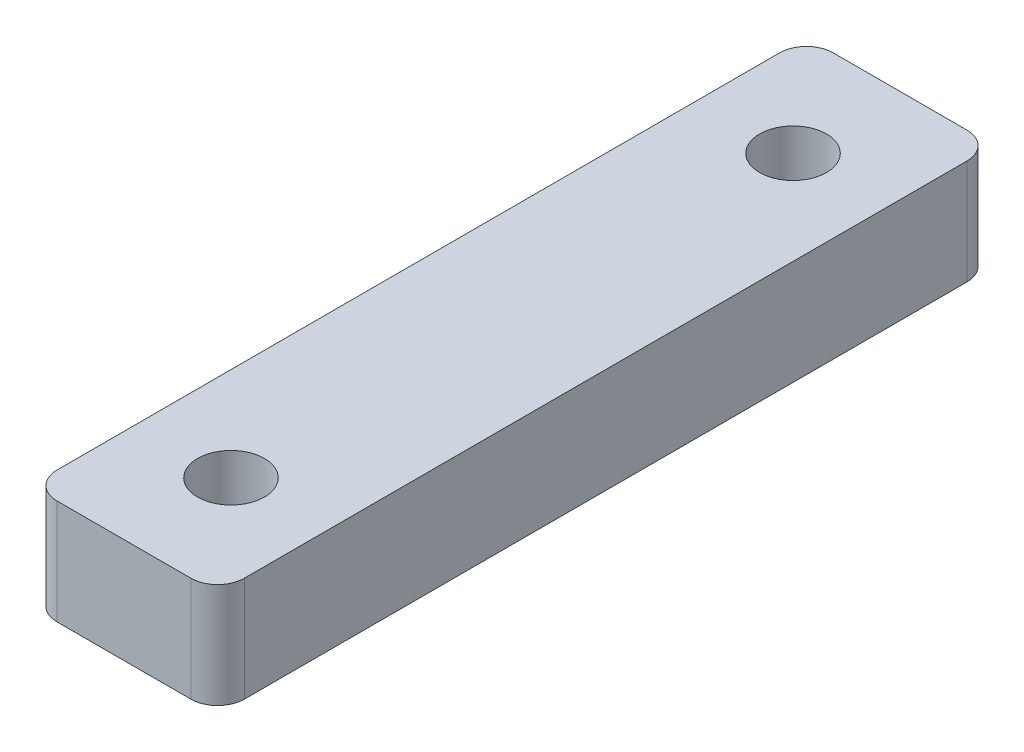
ISO-10303-21;
HEADER;
FILE_DESCRIPTION(('STEP AP214'),'2;1');
FILE_NAME('part.step','',(''),(''),'','','');
FILE_SCHEMA(('AUTOMOTIVE_DESIGN { 1 0 10303 214 1 1 1 1 }'));
ENDSEC;
DATA;
#1=APPLICATION_CONTEXT('core data for automotive mechanical design processes');
#2=APPLICATION_PROTOCOL_DEFINITION('international standard','automotive_design',2000,#1);
#3=PRODUCT_CONTEXT('',#1,'mechanical');
#4=PRODUCT('Part','Part','',(#3));
#5=PRODUCT_RELATED_PRODUCT_CATEGORY('part','',(#4));
#6=PRODUCT_DEFINITION_FORMATION('','',#4);
#7=PRODUCT_DEFINITION_CONTEXT('part definition',#1,'design');
#8=PRODUCT_DEFINITION('design','',#6,#7);
#9=PRODUCT_DEFINITION_SHAPE('','',#8);
#10=(LENGTH_UNIT() NAMED_UNIT(*) SI_UNIT(.MILLI.,.METRE.));
#11=(NAMED_UNIT(*) PLANE_ANGLE_UNIT() SI_UNIT($,.RADIAN.));
#12=(NAMED_UNIT(*) SI_UNIT($,.STERADIAN.) SOLID_ANGLE_UNIT());
#13=UNCERTAINTY_MEASURE_WITH_UNIT(LENGTH_MEASURE(1.E-05),#10,'distance_accuracy_value','');
#14=(GEOMETRIC_REPRESENTATION_CONTEXT(3) GLOBAL_UNCERTAINTY_ASSIGNED_CONTEXT((#13)) GLOBAL_UNIT_ASSIGNED_CONTEXT((#10,
#11,#12)) REPRESENTATION_CONTEXT('',''));
#15=CARTESIAN_POINT('',(0.,0.,0.));
#16=DIRECTION('',(0.,0.,1.));
#17=DIRECTION('',(1.,0.,0.));
#18=AXIS2_PLACEMENT_3D('',#15,#16,#17);
#19=CARTESIAN_POINT('',(0.,7.83,0.));
#20=DIRECTION('',(0.,0.,-1.));
#21=DIRECTION('',(-1.,0.,0.));
#22=AXIS2_PLACEMENT_3D('',#19,#20,#21);
#23=PLANE('',#22);
#24=DIRECTION('',(1.,0.,0.));
#25=VECTOR('',#24,1.);
#26=CARTESIAN_POINT('',(0.,0.,0.));
#27=LINE('',#26,#25);
#28=CARTESIAN_POINT('',(2.,0.,0.));
#29=VERTEX_POINT('',#28);
#30=CARTESIAN_POINT('',(12.,0.,0.));
#31=VERTEX_POINT('',#30);
#32=EDGE_CURVE('E137',#29,#31,#27,.T.);
#33=ORIENTED_EDGE('',*,*,#32,.T.);
#34=DIRECTION('',(0.,-1.,0.));
#35=VECTOR('',#34,1.);
#36=CARTESIAN_POINT('',(12.,7.83,0.));
#37=LINE('',#36,#35);
#38=CARTESIAN_POINT('',(12.,7.83,0.));
#39=VERTEX_POINT('',#38);
#40=EDGE_CURVE('E113',#31,#39,#37,.F.);
#41=ORIENTED_EDGE('',*,*,#40,.T.);
#42=DIRECTION('',(1.,0.,0.));
#43=VECTOR('',#42,1.);
#44=CARTESIAN_POINT('',(0.,7.83,0.));
#45=LINE('',#44,#43);
#46=CARTESIAN_POINT('',(2.,7.83,0.));
#47=VERTEX_POINT('',#46);
#48=EDGE_CURVE('E152',#47,#39,#45,.T.);
#49=ORIENTED_EDGE('',*,*,#48,.F.);
#50=DIRECTION('',(0.,-1.,0.));
#51=VECTOR('',#50,1.);
#52=CARTESIAN_POINT('',(2.,0.,0.));
#53=LINE('',#52,#51);
#54=EDGE_CURVE('E118',#47,#29,#53,.T.);
#55=ORIENTED_EDGE('',*,*,#54,.T.);
#56=EDGE_LOOP('',(#33,#41,#49,#55));
#57=FACE_BOUND('',#56,.T.);
#58=ADVANCED_FACE('F41',(#57),#23,.F.);
#59=CARTESIAN_POINT('',(14.,7.83,0.));
#60=DIRECTION('',(-1.,0.,0.));
#61=DIRECTION('',(0.,0.,1.));
#62=AXIS2_PLACEMENT_3D('',#59,#60,#61);
#63=PLANE('',#62);
#64=DIRECTION('',(0.,0.,-1.));
#65=VECTOR('',#64,1.);
#66=CARTESIAN_POINT('',(14.,7.83,0.));
#67=LINE('',#66,#65);
#68=CARTESIAN_POINT('',(14.,7.83,-2.));
#69=VERTEX_POINT('',#68);
#70=CARTESIAN_POINT('',(14.,7.83,-56.));
#71=VERTEX_POINT('',#70);
#72=EDGE_CURVE('E128',#69,#71,#67,.T.);
#73=ORIENTED_EDGE('',*,*,#72,.F.);
#74=DIRECTION('',(0.,-1.,0.));
#75=VECTOR('',#74,1.);
#76=CARTESIAN_POINT('',(14.,7.83,-2.));
#77=LINE('',#76,#75);
#78=CARTESIAN_POINT('',(14.,0.,-2.));
#79=VERTEX_POINT('',#78);
#80=EDGE_CURVE('E112',#69,#79,#77,.T.);
#81=ORIENTED_EDGE('',*,*,#80,.T.);
#82=DIRECTION('',(0.,0.,-1.));
#83=VECTOR('',#82,1.);
#84=CARTESIAN_POINT('',(14.,0.,0.));
#85=LINE('',#84,#83);
#86=CARTESIAN_POINT('',(14.,0.,-56.));
#87=VERTEX_POINT('',#86);
#88=EDGE_CURVE('E125',#79,#87,#85,.T.);
#89=ORIENTED_EDGE('',*,*,#88,.T.);
#90=DIRECTION('',(0.,-1.,0.));
#91=VECTOR('',#90,1.);
#92=CARTESIAN_POINT('',(14.,7.83,-56.));
#93=LINE('',#92,#91);
#94=EDGE_CURVE('E130',#87,#71,#93,.F.);
#95=ORIENTED_EDGE('',*,*,#94,.T.);
#96=EDGE_LOOP('',(#73,#81,#89,#95));
#97=FACE_BOUND('',#96,.T.);
#98=ADVANCED_FACE('F124',(#97),#63,.F.);
#99=CARTESIAN_POINT('',(0.,7.83,-58.));
#100=DIRECTION('',(0.,0.,-1.));
#101=DIRECTION('',(-1.,0.,0.));
#102=AXIS2_PLACEMENT_3D('',#99,#100,#101);
#103=PLANE('',#102);
#104=DIRECTION('',(1.,0.,0.));
#105=VECTOR('',#104,1.);
#106=CARTESIAN_POINT('',(0.,7.83,-58.));
#107=LINE('',#106,#105);
#108=CARTESIAN_POINT('',(2.,7.83,-58.));
#109=VERTEX_POINT('',#108);
#110=CARTESIAN_POINT('',(12.,7.83,-58.));
#111=VERTEX_POINT('',#110);
#112=EDGE_CURVE('E176',#109,#111,#107,.T.);
#113=ORIENTED_EDGE('',*,*,#112,.T.);
#114=DIRECTION('',(0.,-1.,0.));
#115=VECTOR('',#114,1.);
#116=CARTESIAN_POINT('',(12.,0.,-58.));
#117=LINE('',#116,#115);
#118=CARTESIAN_POINT('',(12.,0.,-58.));
#119=VERTEX_POINT('',#118);
#120=EDGE_CURVE('E11',#111,#119,#117,.T.);
#121=ORIENTED_EDGE('',*,*,#120,.T.);
#122=DIRECTION('',(1.,0.,0.));
#123=VECTOR('',#122,1.);
#124=CARTESIAN_POINT('',(0.,0.,-58.));
#125=LINE('',#124,#123);
#126=CARTESIAN_POINT('',(2.,0.,-58.));
#127=VERTEX_POINT('',#126);
#128=EDGE_CURVE('E136',#127,#119,#125,.T.);
#129=ORIENTED_EDGE('',*,*,#128,.F.);
#130=DIRECTION('',(0.,-1.,0.));
#131=VECTOR('',#130,1.);
#132=CARTESIAN_POINT('',(2.,7.83,-58.));
#133=LINE('',#132,#131);
#134=EDGE_CURVE('E49',#127,#109,#133,.F.);
#135=ORIENTED_EDGE('',*,*,#134,.T.);
#136=EDGE_LOOP('',(#113,#121,#129,#135));
#137=FACE_BOUND('',#136,.T.);
#138=ADVANCED_FACE('F175',(#137),#103,.T.);
#139=CARTESIAN_POINT('',(7.,7.83,-50.));
#140=DIRECTION('',(0.,-1.,0.));
#141=DIRECTION('',(0.,0.,-1.));
#142=AXIS2_PLACEMENT_3D('',#139,#140,#141);
#143=CYLINDRICAL_SURFACE('',#142,2.5);
#144=CARTESIAN_POINT('',(7.,7.83,-50.));
#145=DIRECTION('',(0.,1.,0.));
#146=DIRECTION('',(0.,0.,1.));
#147=AXIS2_PLACEMENT_3D('',#144,#145,#146);
#148=CIRCLE('',#147,2.5);
#149=CARTESIAN_POINT('',(7.,7.83,-47.5));
#150=VERTEX_POINT('',#149);
#151=EDGE_CURVE('E197',#150,#150,#148,.T.);
#152=ORIENTED_EDGE('',*,*,#151,.T.);
#153=EDGE_LOOP('',(#152));
#154=FACE_BOUND('',#153,.T.);
#155=CARTESIAN_POINT('',(7.,0.,-50.));
#156=DIRECTION('',(0.,1.,0.));
#157=DIRECTION('',(0.,0.,1.));
#158=AXIS2_PLACEMENT_3D('',#155,#156,#157);
#159=CIRCLE('',#158,2.5);
#160=CARTESIAN_POINT('',(7.,0.,-47.5));
#161=VERTEX_POINT('',#160);
#162=EDGE_CURVE('E146',#161,#161,#159,.T.);
#163=ORIENTED_EDGE('',*,*,#162,.F.);
#164=EDGE_LOOP('',(#163));
#165=FACE_BOUND('',#164,.T.);
#166=ADVANCED_FACE('F277',(#154,#165),#143,.F.);
#167=CARTESIAN_POINT('',(0.,7.83,0.));
#168=DIRECTION('',(-1.,0.,0.));
#169=DIRECTION('',(0.,0.,1.));
#170=AXIS2_PLACEMENT_3D('',#167,#168,#169);
#171=PLANE('',#170);
#172=DIRECTION('',(0.,0.,-1.));
#173=VECTOR('',#172,1.);
#174=CARTESIAN_POINT('',(0.,0.,0.));
#175=LINE('',#174,#173);
#176=CARTESIAN_POINT('',(0.,0.,-2.));
#177=VERTEX_POINT('',#176);
#178=CARTESIAN_POINT('',(0.,0.,-56.));
#179=VERTEX_POINT('',#178);
#180=EDGE_CURVE('E139',#177,#179,#175,.T.);
#181=ORIENTED_EDGE('',*,*,#180,.F.);
#182=DIRECTION('',(0.,-1.,0.));
#183=VECTOR('',#182,1.);
#184=CARTESIAN_POINT('',(0.,7.83,-2.));
#185=LINE('',#184,#183);
#186=CARTESIAN_POINT('',(0.,7.83,-2.));
#187=VERTEX_POINT('',#186);
#188=EDGE_CURVE('E63',#177,#187,#185,.F.);
#189=ORIENTED_EDGE('',*,*,#188,.T.);
#190=DIRECTION('',(0.,0.,-1.));
#191=VECTOR('',#190,1.);
#192=CARTESIAN_POINT('',(0.,7.83,0.));
#193=LINE('',#192,#191);
#194=CARTESIAN_POINT('',(0.,7.83,-56.));
#195=VERTEX_POINT('',#194);
#196=EDGE_CURVE('E183',#187,#195,#193,.T.);
#197=ORIENTED_EDGE('',*,*,#196,.T.);
#198=DIRECTION('',(0.,-1.,0.));
#199=VECTOR('',#198,1.);
#200=CARTESIAN_POINT('',(0.,7.83,-56.));
#201=LINE('',#200,#199);
#202=EDGE_CURVE('E168',#195,#179,#201,.T.);
#203=ORIENTED_EDGE('',*,*,#202,.T.);
#204=EDGE_LOOP('',(#181,#189,#197,#203));
#205=FACE_BOUND('',#204,.T.);
#206=ADVANCED_FACE('F186',(#205),#171,.T.);
#207=CARTESIAN_POINT('',(7.,7.83,-8.));
#208=DIRECTION('',(0.,-1.,0.));
#209=DIRECTION('',(0.,0.,-1.));
#210=AXIS2_PLACEMENT_3D('',#207,#208,#209);
#211=CYLINDRICAL_SURFACE('',#210,2.5);
#212=CARTESIAN_POINT('',(7.,7.83,-8.));
#213=DIRECTION('',(0.,1.,0.));
#214=DIRECTION('',(0.,0.,1.));
#215=AXIS2_PLACEMENT_3D('',#212,#213,#214);
#216=CIRCLE('',#215,2.5);
#217=CARTESIAN_POINT('',(7.,7.83,-5.5));
#218=VERTEX_POINT('',#217);
#219=EDGE_CURVE('E153',#218,#218,#216,.F.);
#220=ORIENTED_EDGE('',*,*,#219,.F.);
#221=EDGE_LOOP('',(#220));
#222=FACE_BOUND('',#221,.T.);
#223=CARTESIAN_POINT('',(7.,0.,-8.));
#224=DIRECTION('',(0.,1.,0.));
#225=DIRECTION('',(0.,0.,1.));
#226=AXIS2_PLACEMENT_3D('',#223,#224,#225);
#227=CIRCLE('',#226,2.5);
#228=CARTESIAN_POINT('',(7.,0.,-5.5));
#229=VERTEX_POINT('',#228);
#230=EDGE_CURVE('E149',#229,#229,#227,.F.);
#231=ORIENTED_EDGE('',*,*,#230,.T.);
#232=EDGE_LOOP('',(#231));
#233=FACE_BOUND('',#232,.T.);
#234=ADVANCED_FACE('F203',(#222,#233),#211,.F.);
#235=CARTESIAN_POINT('',(0.,7.83,0.));
#236=DIRECTION('',(0.,1.,0.));
#237=DIRECTION('',(0.,0.,1.));
#238=AXIS2_PLACEMENT_3D('',#235,#236,#237);
#239=PLANE('',#238);
#240=ORIENTED_EDGE('',*,*,#48,.T.);
#241=CARTESIAN_POINT('',(12.,7.83,-2.));
#242=DIRECTION('',(0.,1.,0.));
#243=DIRECTION('',(0.,0.,1.));
#244=AXIS2_PLACEMENT_3D('',#241,#242,#243);
#245=CIRCLE('',#244,2.);
#246=EDGE_CURVE('E166',#39,#69,#245,.T.);
#247=ORIENTED_EDGE('',*,*,#246,.T.);
#248=ORIENTED_EDGE('',*,*,#72,.T.);
#249=CARTESIAN_POINT('',(12.,7.83,-56.));
#250=DIRECTION('',(0.,1.,0.));
#251=DIRECTION('',(0.,0.,1.));
#252=AXIS2_PLACEMENT_3D('',#249,#250,#251);
#253=CIRCLE('',#252,2.);
#254=EDGE_CURVE('E162',#71,#111,#253,.T.);
#255=ORIENTED_EDGE('',*,*,#254,.T.);
#256=ORIENTED_EDGE('',*,*,#112,.F.);
#257=CARTESIAN_POINT('',(2.,7.83,-56.));
#258=DIRECTION('',(0.,1.,0.));
#259=DIRECTION('',(0.,0.,1.));
#260=AXIS2_PLACEMENT_3D('',#257,#258,#259);
#261=CIRCLE('',#260,2.);
#262=EDGE_CURVE('E56',#109,#195,#261,.T.);
#263=ORIENTED_EDGE('',*,*,#262,.T.);
#264=ORIENTED_EDGE('',*,*,#196,.F.);
#265=CARTESIAN_POINT('',(2.,7.83,-2.));
#266=DIRECTION('',(0.,1.,0.));
#267=DIRECTION('',(0.,0.,1.));
#268=AXIS2_PLACEMENT_3D('',#265,#266,#267);
#269=CIRCLE('',#268,2.);
#270=EDGE_CURVE('E164',#187,#47,#269,.T.);
#271=ORIENTED_EDGE('',*,*,#270,.T.);
#272=EDGE_LOOP('',(#240,#247,#248,#255,#256,#263,#264,#271));
#273=FACE_BOUND('',#272,.T.);
#274=ORIENTED_EDGE('',*,*,#151,.F.);
#275=EDGE_LOOP('',(#274));
#276=FACE_BOUND('',#275,.T.);
#277=ORIENTED_EDGE('',*,*,#219,.T.);
#278=EDGE_LOOP('',(#277));
#279=FACE_BOUND('',#278,.T.);
#280=ADVANCED_FACE('F180',(#273,#276,#279),#239,.T.);
#281=CARTESIAN_POINT('',(0.,0.,0.));
#282=DIRECTION('',(0.,1.,0.));
#283=DIRECTION('',(0.,0.,1.));
#284=AXIS2_PLACEMENT_3D('',#281,#282,#283);
#285=PLANE('',#284);
#286=ORIENTED_EDGE('',*,*,#88,.F.);
#287=CARTESIAN_POINT('',(12.,0.,-2.));
#288=DIRECTION('',(0.,1.,0.));
#289=DIRECTION('',(0.,0.,1.));
#290=AXIS2_PLACEMENT_3D('',#287,#288,#289);
#291=CIRCLE('',#290,2.);
#292=EDGE_CURVE('E108',#79,#31,#291,.F.);
#293=ORIENTED_EDGE('',*,*,#292,.T.);
#294=ORIENTED_EDGE('',*,*,#32,.F.);
#295=CARTESIAN_POINT('',(2.,0.,-2.));
#296=DIRECTION('',(0.,1.,0.));
#297=DIRECTION('',(0.,0.,1.));
#298=AXIS2_PLACEMENT_3D('',#295,#296,#297);
#299=CIRCLE('',#298,2.);
#300=EDGE_CURVE('E119',#29,#177,#299,.F.);
#301=ORIENTED_EDGE('',*,*,#300,.T.);
#302=ORIENTED_EDGE('',*,*,#180,.T.);
#303=CARTESIAN_POINT('',(2.,0.,-56.));
#304=DIRECTION('',(0.,1.,0.));
#305=DIRECTION('',(0.,0.,1.));
#306=AXIS2_PLACEMENT_3D('',#303,#304,#305);
#307=CIRCLE('',#306,2.);
#308=EDGE_CURVE('E129',#179,#127,#307,.F.);
#309=ORIENTED_EDGE('',*,*,#308,.T.);
#310=ORIENTED_EDGE('',*,*,#128,.T.);
#311=CARTESIAN_POINT('',(12.,0.,-56.));
#312=DIRECTION('',(0.,1.,0.));
#313=DIRECTION('',(0.,0.,1.));
#314=AXIS2_PLACEMENT_3D('',#311,#312,#313);
#315=CIRCLE('',#314,2.);
#316=EDGE_CURVE('E135',#119,#87,#315,.F.);
#317=ORIENTED_EDGE('',*,*,#316,.T.);
#318=EDGE_LOOP('',(#286,#293,#294,#301,#302,#309,#310,#317));
#319=FACE_BOUND('',#318,.T.);
#320=ORIENTED_EDGE('',*,*,#162,.T.);
#321=EDGE_LOOP('',(#320));
#322=FACE_BOUND('',#321,.T.);
#323=ORIENTED_EDGE('',*,*,#230,.F.);
#324=EDGE_LOOP('',(#323));
#325=FACE_BOUND('',#324,.T.);
#326=ADVANCED_FACE('F132',(#319,#322,#325),#285,.F.);
#327=CARTESIAN_POINT('',(12.,7.83,-2.));
#328=DIRECTION('',(0.,-1.,0.));
#329=DIRECTION('',(0.,0.,-1.));
#330=AXIS2_PLACEMENT_3D('',#327,#328,#329);
#331=CYLINDRICAL_SURFACE('',#330,2.);
#332=ORIENTED_EDGE('',*,*,#246,.F.);
#333=ORIENTED_EDGE('',*,*,#40,.F.);
#334=ORIENTED_EDGE('',*,*,#292,.F.);
#335=ORIENTED_EDGE('',*,*,#80,.F.);
#336=EDGE_LOOP('',(#332,#333,#334,#335));
#337=FACE_BOUND('',#336,.T.);
#338=ADVANCED_FACE('F111',(#337),#331,.T.);
#339=CARTESIAN_POINT('',(2.,7.83,-2.));
#340=DIRECTION('',(0.,1.,0.));
#341=DIRECTION('',(0.,0.,1.));
#342=AXIS2_PLACEMENT_3D('',#339,#340,#341);
#343=CYLINDRICAL_SURFACE('',#342,2.);
#344=ORIENTED_EDGE('',*,*,#270,.F.);
#345=ORIENTED_EDGE('',*,*,#188,.F.);
#346=ORIENTED_EDGE('',*,*,#300,.F.);
#347=ORIENTED_EDGE('',*,*,#54,.F.);
#348=EDGE_LOOP('',(#344,#345,#346,#347));
#349=FACE_BOUND('',#348,.T.);
#350=ADVANCED_FACE('F190',(#349),#343,.T.);
#351=CARTESIAN_POINT('',(12.,7.83,-56.));
#352=DIRECTION('',(0.,1.,0.));
#353=DIRECTION('',(0.,0.,1.));
#354=AXIS2_PLACEMENT_3D('',#351,#352,#353);
#355=CYLINDRICAL_SURFACE('',#354,2.);
#356=ORIENTED_EDGE('',*,*,#254,.F.);
#357=ORIENTED_EDGE('',*,*,#94,.F.);
#358=ORIENTED_EDGE('',*,*,#316,.F.);
#359=ORIENTED_EDGE('',*,*,#120,.F.);
#360=EDGE_LOOP('',(#356,#357,#358,#359));
#361=FACE_BOUND('',#360,.T.);
#362=ADVANCED_FACE('F226',(#361),#355,.T.);
#363=CARTESIAN_POINT('',(2.,7.83,-56.));
#364=DIRECTION('',(0.,-1.,0.));
#365=DIRECTION('',(0.,0.,-1.));
#366=AXIS2_PLACEMENT_3D('',#363,#364,#365);
#367=CYLINDRICAL_SURFACE('',#366,2.);
#368=ORIENTED_EDGE('',*,*,#262,.F.);
#369=ORIENTED_EDGE('',*,*,#134,.F.);
#370=ORIENTED_EDGE('',*,*,#308,.F.);
#371=ORIENTED_EDGE('',*,*,#202,.F.);
#372=EDGE_LOOP('',(#368,#369,#370,#371));
#373=FACE_BOUND('',#372,.T.);
#374=ADVANCED_FACE('F43',(#373),#367,.T.);
#375=CLOSED_SHELL('',(#58,#98,#138,#166,#206,#234,#280,#326,#338,#350,#362,#374));
#376=MANIFOLD_SOLID_BREP('B2',#375);
#377=ADVANCED_BREP_SHAPE_REPRESENTATION('',(#18,#376),#14);
#378=SHAPE_DEFINITION_REPRESENTATION(#9,#377);
ENDSEC;
END-ISO-10303-21;
